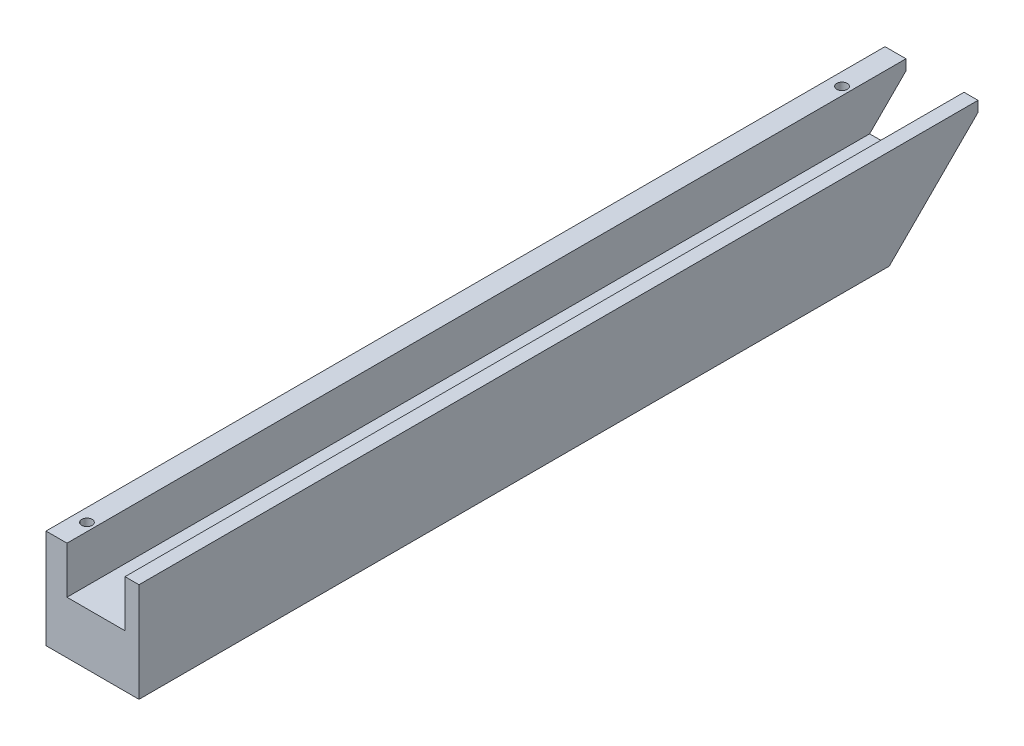
ISO-10303-21;
HEADER;
FILE_DESCRIPTION(('STEP AP214'),'2;1');
FILE_NAME('part.step','',(''),(''),'','','');
FILE_SCHEMA(('AUTOMOTIVE_DESIGN { 1 0 10303 214 1 1 1 1 }'));
ENDSEC;
DATA;
#1=APPLICATION_CONTEXT('core data for automotive mechanical design processes');
#2=APPLICATION_PROTOCOL_DEFINITION('international standard','automotive_design',2000,#1);
#3=PRODUCT_CONTEXT('',#1,'mechanical');
#4=PRODUCT('Part','Part','',(#3));
#5=PRODUCT_RELATED_PRODUCT_CATEGORY('part','',(#4));
#6=PRODUCT_DEFINITION_FORMATION('','',#4);
#7=PRODUCT_DEFINITION_CONTEXT('part definition',#1,'design');
#8=PRODUCT_DEFINITION('design','',#6,#7);
#9=PRODUCT_DEFINITION_SHAPE('','',#8);
#10=(LENGTH_UNIT() NAMED_UNIT(*) SI_UNIT(.MILLI.,.METRE.));
#11=(NAMED_UNIT(*) PLANE_ANGLE_UNIT() SI_UNIT($,.RADIAN.));
#12=(NAMED_UNIT(*) SI_UNIT($,.STERADIAN.) SOLID_ANGLE_UNIT());
#13=UNCERTAINTY_MEASURE_WITH_UNIT(LENGTH_MEASURE(1.E-05),#10,'distance_accuracy_value','');
#14=(GEOMETRIC_REPRESENTATION_CONTEXT(3) GLOBAL_UNCERTAINTY_ASSIGNED_CONTEXT((#13)) GLOBAL_UNIT_ASSIGNED_CONTEXT((#10,
#11,#12)) REPRESENTATION_CONTEXT('',''));
#15=CARTESIAN_POINT('',(0.,0.,0.));
#16=DIRECTION('',(0.,0.,1.));
#17=DIRECTION('',(1.,0.,0.));
#18=AXIS2_PLACEMENT_3D('',#15,#16,#17);
#19=CARTESIAN_POINT('',(0.,0.,0.));
#20=DIRECTION('',(0.,0.,-1.));
#21=DIRECTION('',(-1.,0.,0.));
#22=AXIS2_PLACEMENT_3D('',#19,#20,#21);
#23=PLANE('',#22);
#24=DIRECTION('',(-1.,0.,0.));
#25=VECTOR('',#24,1.);
#26=CARTESIAN_POINT('',(17.2910714285715,5.27857142857141,0.));
#27=LINE('',#26,#25);
#28=CARTESIAN_POINT('',(6.99107142857146,5.27857142857141,0.));
#29=VERTEX_POINT('',#28);
#30=CARTESIAN_POINT('',(3.99107142857146,5.27857142857141,0.));
#31=VERTEX_POINT('',#30);
#32=EDGE_CURVE('E183',#29,#31,#27,.T.);
#33=ORIENTED_EDGE('',*,*,#32,.T.);
#34=DIRECTION('',(0.,-1.,0.));
#35=VECTOR('',#34,1.);
#36=CARTESIAN_POINT('',(3.99107142857146,-7.42142857142859,0.));
#37=LINE('',#36,#35);
#38=CARTESIAN_POINT('',(3.99107142857146,6.77857142857141,0.));
#39=VERTEX_POINT('',#38);
#40=EDGE_CURVE('E137',#39,#31,#37,.T.);
#41=ORIENTED_EDGE('',*,*,#40,.F.);
#42=DIRECTION('',(-1.,0.,0.));
#43=VECTOR('',#42,1.);
#44=CARTESIAN_POINT('',(3.99107142857146,6.77857142857141,0.));
#45=LINE('',#44,#43);
#46=CARTESIAN_POINT('',(6.99107142857146,6.7785714285714,0.));
#47=VERTEX_POINT('',#46);
#48=EDGE_CURVE('E85',#47,#39,#45,.T.);
#49=ORIENTED_EDGE('',*,*,#48,.F.);
#50=DIRECTION('',(0.,1.,0.));
#51=VECTOR('',#50,1.);
#52=CARTESIAN_POINT('',(6.99107142857146,6.7785714285714,0.));
#53=LINE('',#52,#51);
#54=EDGE_CURVE('E148',#29,#47,#53,.T.);
#55=ORIENTED_EDGE('',*,*,#54,.F.);
#56=EDGE_LOOP('',(#33,#41,#49,#55));
#57=FACE_BOUND('',#56,.T.);
#58=ADVANCED_FACE('F39',(#57),#23,.T.);
#59=CARTESIAN_POINT('',(3.99107142857146,-7.42142857142859,120.));
#60=DIRECTION('',(1.,0.,0.));
#61=DIRECTION('',(0.,1.,0.));
#62=AXIS2_PLACEMENT_3D('',#59,#60,#61);
#63=PLANE('',#62);
#64=ORIENTED_EDGE('',*,*,#40,.T.);
#65=DIRECTION('',(0.,0.707106781186549,-0.707106781186546));
#66=VECTOR('',#65,1.);
#67=CARTESIAN_POINT('',(3.99107142857146,-7.42142857142859,12.7));
#68=LINE('',#67,#66);
#69=CARTESIAN_POINT('',(3.99107142857146,-7.42142857142859,12.7));
#70=VERTEX_POINT('',#69);
#71=EDGE_CURVE('E188',#70,#31,#68,.T.);
#72=ORIENTED_EDGE('',*,*,#71,.F.);
#73=DIRECTION('',(0.,0.,-1.));
#74=VECTOR('',#73,1.);
#75=CARTESIAN_POINT('',(3.99107142857146,-7.42142857142859,120.));
#76=LINE('',#75,#74);
#77=CARTESIAN_POINT('',(3.99107142857146,-7.42142857142859,120.));
#78=VERTEX_POINT('',#77);
#79=EDGE_CURVE('E11',#78,#70,#76,.T.);
#80=ORIENTED_EDGE('',*,*,#79,.F.);
#81=DIRECTION('',(0.,-1.,0.));
#82=VECTOR('',#81,1.);
#83=CARTESIAN_POINT('',(3.99107142857146,-7.42142857142859,120.));
#84=LINE('',#83,#82);
#85=CARTESIAN_POINT('',(3.99107142857146,6.77857142857141,120.));
#86=VERTEX_POINT('',#85);
#87=EDGE_CURVE('E151',#86,#78,#84,.T.);
#88=ORIENTED_EDGE('',*,*,#87,.F.);
#89=DIRECTION('',(0.,0.,-1.));
#90=VECTOR('',#89,1.);
#91=CARTESIAN_POINT('',(3.99107142857146,6.77857142857141,120.));
#92=LINE('',#91,#90);
#93=EDGE_CURVE('E133',#86,#39,#92,.T.);
#94=ORIENTED_EDGE('',*,*,#93,.T.);
#95=EDGE_LOOP('',(#64,#72,#80,#88,#94));
#96=FACE_BOUND('',#95,.T.);
#97=ADVANCED_FACE('F41',(#96),#63,.F.);
#98=CARTESIAN_POINT('',(17.2910714285715,-7.42142857142859,120.));
#99=DIRECTION('',(0.,1.,0.));
#100=DIRECTION('',(-1.,0.,0.));
#101=AXIS2_PLACEMENT_3D('',#98,#99,#100);
#102=PLANE('',#101);
#103=CARTESIAN_POINT('',(5.84107142857147,-7.42142857142859,116.));
#104=DIRECTION('',(0.,1.,0.));
#105=DIRECTION('',(0.,0.,1.));
#106=AXIS2_PLACEMENT_3D('',#103,#104,#105);
#107=CIRCLE('',#106,0.750000000000001);
#108=CARTESIAN_POINT('',(5.84107142857147,-7.42142857142859,116.75));
#109=VERTEX_POINT('',#108);
#110=EDGE_CURVE('E197',#109,#109,#107,.T.);
#111=ORIENTED_EDGE('',*,*,#110,.T.);
#112=EDGE_LOOP('',(#111));
#113=FACE_BOUND('',#112,.T.);
#114=ORIENTED_EDGE('',*,*,#79,.T.);
#115=DIRECTION('',(-1.,0.,0.));
#116=VECTOR('',#115,1.);
#117=CARTESIAN_POINT('',(17.2910714285715,-7.42142857142859,12.7));
#118=LINE('',#117,#116);
#119=CARTESIAN_POINT('',(17.2910714285715,-7.42142857142859,12.7));
#120=VERTEX_POINT('',#119);
#121=EDGE_CURVE('E178',#120,#70,#118,.T.);
#122=ORIENTED_EDGE('',*,*,#121,.F.);
#123=DIRECTION('',(0.,0.,-1.));
#124=VECTOR('',#123,1.);
#125=CARTESIAN_POINT('',(17.2910714285715,-7.42142857142859,120.));
#126=LINE('',#125,#124);
#127=CARTESIAN_POINT('',(17.2910714285715,-7.42142857142859,120.));
#128=VERTEX_POINT('',#127);
#129=EDGE_CURVE('E48',#128,#120,#126,.T.);
#130=ORIENTED_EDGE('',*,*,#129,.F.);
#131=DIRECTION('',(1.,0.,0.));
#132=VECTOR('',#131,1.);
#133=CARTESIAN_POINT('',(17.2910714285715,-7.42142857142859,120.));
#134=LINE('',#133,#132);
#135=EDGE_CURVE('E93',#78,#128,#134,.T.);
#136=ORIENTED_EDGE('',*,*,#135,.F.);
#137=EDGE_LOOP('',(#114,#122,#130,#136));
#138=FACE_BOUND('',#137,.T.);
#139=ADVANCED_FACE('F176',(#113,#138),#102,.F.);
#140=CARTESIAN_POINT('',(17.2910714285715,6.77857142857141,120.));
#141=DIRECTION('',(-1.,0.,0.));
#142=DIRECTION('',(0.,0.,1.));
#143=AXIS2_PLACEMENT_3D('',#140,#141,#142);
#144=PLANE('',#143);
#145=ORIENTED_EDGE('',*,*,#129,.T.);
#146=DIRECTION('',(0.,0.707106781186549,-0.707106781186546));
#147=VECTOR('',#146,1.);
#148=CARTESIAN_POINT('',(17.2910714285715,-7.42142857142859,12.7));
#149=LINE('',#148,#147);
#150=CARTESIAN_POINT('',(17.2910714285715,5.27857142857141,0.));
#151=VERTEX_POINT('',#150);
#152=EDGE_CURVE('E169',#120,#151,#149,.T.);
#153=ORIENTED_EDGE('',*,*,#152,.T.);
#154=DIRECTION('',(0.,1.,0.));
#155=VECTOR('',#154,1.);
#156=CARTESIAN_POINT('',(17.2910714285715,6.77857142857141,0.));
#157=LINE('',#156,#155);
#158=CARTESIAN_POINT('',(17.2910714285715,6.77857142857141,0.));
#159=VERTEX_POINT('',#158);
#160=EDGE_CURVE('E140',#151,#159,#157,.T.);
#161=ORIENTED_EDGE('',*,*,#160,.T.);
#162=DIRECTION('',(0.,0.,-1.));
#163=VECTOR('',#162,1.);
#164=CARTESIAN_POINT('',(17.2910714285715,6.77857142857141,120.));
#165=LINE('',#164,#163);
#166=CARTESIAN_POINT('',(17.2910714285715,6.77857142857141,120.));
#167=VERTEX_POINT('',#166);
#168=EDGE_CURVE('E158',#167,#159,#165,.T.);
#169=ORIENTED_EDGE('',*,*,#168,.F.);
#170=DIRECTION('',(0.,1.,0.));
#171=VECTOR('',#170,1.);
#172=CARTESIAN_POINT('',(17.2910714285715,6.77857142857141,120.));
#173=LINE('',#172,#171);
#174=EDGE_CURVE('E172',#128,#167,#173,.T.);
#175=ORIENTED_EDGE('',*,*,#174,.F.);
#176=EDGE_LOOP('',(#145,#153,#161,#169,#175));
#177=FACE_BOUND('',#176,.T.);
#178=ADVANCED_FACE('F166',(#177),#144,.F.);
#179=CARTESIAN_POINT('',(15.2910714285714,6.77857142857141,120.));
#180=DIRECTION('',(0.,-1.,0.));
#181=DIRECTION('',(0.,0.,-1.));
#182=AXIS2_PLACEMENT_3D('',#179,#180,#181);
#183=PLANE('',#182);
#184=DIRECTION('',(-1.,0.,0.));
#185=VECTOR('',#184,1.);
#186=CARTESIAN_POINT('',(15.2910714285714,6.77857142857141,0.));
#187=LINE('',#186,#185);
#188=CARTESIAN_POINT('',(15.2910714285714,6.77857142857141,0.));
#189=VERTEX_POINT('',#188);
#190=EDGE_CURVE('E143',#159,#189,#187,.T.);
#191=ORIENTED_EDGE('',*,*,#190,.T.);
#192=DIRECTION('',(0.,0.,-1.));
#193=VECTOR('',#192,1.);
#194=CARTESIAN_POINT('',(15.2910714285714,6.77857142857141,120.));
#195=LINE('',#194,#193);
#196=CARTESIAN_POINT('',(15.2910714285714,6.77857142857141,120.));
#197=VERTEX_POINT('',#196);
#198=EDGE_CURVE('E155',#197,#189,#195,.T.);
#199=ORIENTED_EDGE('',*,*,#198,.F.);
#200=DIRECTION('',(-1.,0.,0.));
#201=VECTOR('',#200,1.);
#202=CARTESIAN_POINT('',(15.2910714285714,6.77857142857141,120.));
#203=LINE('',#202,#201);
#204=EDGE_CURVE('E207',#167,#197,#203,.T.);
#205=ORIENTED_EDGE('',*,*,#204,.F.);
#206=ORIENTED_EDGE('',*,*,#168,.T.);
#207=EDGE_LOOP('',(#191,#199,#205,#206));
#208=FACE_BOUND('',#207,.T.);
#209=ADVANCED_FACE('F211',(#208),#183,.F.);
#210=CARTESIAN_POINT('',(15.2910714285714,0.0785714285714044,120.));
#211=DIRECTION('',(1.,0.,0.));
#212=DIRECTION('',(0.,0.,-1.));
#213=AXIS2_PLACEMENT_3D('',#210,#211,#212);
#214=PLANE('',#213);
#215=DIRECTION('',(0.,-1.,0.));
#216=VECTOR('',#215,1.);
#217=CARTESIAN_POINT('',(15.2910714285714,0.0785714285714044,0.));
#218=LINE('',#217,#216);
#219=CARTESIAN_POINT('',(15.2910714285714,5.27857142857141,0.));
#220=VERTEX_POINT('',#219);
#221=EDGE_CURVE('E145',#189,#220,#218,.T.);
#222=ORIENTED_EDGE('',*,*,#221,.T.);
#223=DIRECTION('',(0.,-0.707106781186549,0.707106781186546));
#224=VECTOR('',#223,1.);
#225=CARTESIAN_POINT('',(15.2910714285714,-57.3214285714286,62.5999999999998));
#226=LINE('',#225,#224);
#227=CARTESIAN_POINT('',(15.2910714285714,0.0785714285714044,5.19999999999998));
#228=VERTEX_POINT('',#227);
#229=EDGE_CURVE('E55',#220,#228,#226,.T.);
#230=ORIENTED_EDGE('',*,*,#229,.T.);
#231=DIRECTION('',(0.,0.,-1.));
#232=VECTOR('',#231,1.);
#233=CARTESIAN_POINT('',(15.2910714285714,0.0785714285714044,120.));
#234=LINE('',#233,#232);
#235=CARTESIAN_POINT('',(15.2910714285714,0.0785714285714044,120.));
#236=VERTEX_POINT('',#235);
#237=EDGE_CURVE('E128',#236,#228,#234,.T.);
#238=ORIENTED_EDGE('',*,*,#237,.F.);
#239=DIRECTION('',(0.,-1.,0.));
#240=VECTOR('',#239,1.);
#241=CARTESIAN_POINT('',(15.2910714285714,0.0785714285714044,120.));
#242=LINE('',#241,#240);
#243=EDGE_CURVE('E115',#197,#236,#242,.T.);
#244=ORIENTED_EDGE('',*,*,#243,.F.);
#245=ORIENTED_EDGE('',*,*,#198,.T.);
#246=EDGE_LOOP('',(#222,#230,#238,#244,#245));
#247=FACE_BOUND('',#246,.T.);
#248=ADVANCED_FACE('F215',(#247),#214,.F.);
#249=CARTESIAN_POINT('',(6.99107142857146,0.0785714285714044,120.));
#250=DIRECTION('',(0.,-1.,0.));
#251=DIRECTION('',(0.,0.,-1.));
#252=AXIS2_PLACEMENT_3D('',#249,#250,#251);
#253=PLANE('',#252);
#254=ORIENTED_EDGE('',*,*,#237,.T.);
#255=DIRECTION('',(-1.,0.,0.));
#256=VECTOR('',#255,1.);
#257=CARTESIAN_POINT('',(6.99107142857149,0.0785714285714044,5.19999999999998));
#258=LINE('',#257,#256);
#259=CARTESIAN_POINT('',(6.99107142857146,0.078571428571407,5.19999999999998));
#260=VERTEX_POINT('',#259);
#261=EDGE_CURVE('E125',#228,#260,#258,.T.);
#262=ORIENTED_EDGE('',*,*,#261,.T.);
#263=DIRECTION('',(0.,0.,-1.));
#264=VECTOR('',#263,1.);
#265=CARTESIAN_POINT('',(6.99107142857146,0.0785714285714044,120.));
#266=LINE('',#265,#264);
#267=CARTESIAN_POINT('',(6.99107142857146,0.0785714285714044,120.));
#268=VERTEX_POINT('',#267);
#269=EDGE_CURVE('E122',#268,#260,#266,.T.);
#270=ORIENTED_EDGE('',*,*,#269,.F.);
#271=DIRECTION('',(-1.,0.,0.));
#272=VECTOR('',#271,1.);
#273=CARTESIAN_POINT('',(6.99107142857146,0.0785714285714044,120.));
#274=LINE('',#273,#272);
#275=EDGE_CURVE('E108',#236,#268,#274,.T.);
#276=ORIENTED_EDGE('',*,*,#275,.F.);
#277=EDGE_LOOP('',(#254,#262,#270,#276));
#278=FACE_BOUND('',#277,.T.);
#279=ADVANCED_FACE('F123',(#278),#253,.F.);
#280=CARTESIAN_POINT('',(6.99107142857146,6.7785714285714,120.));
#281=DIRECTION('',(-1.,0.,0.));
#282=DIRECTION('',(0.,-1.,0.));
#283=AXIS2_PLACEMENT_3D('',#280,#281,#282);
#284=PLANE('',#283);
#285=ORIENTED_EDGE('',*,*,#269,.T.);
#286=DIRECTION('',(0.,0.707106781186549,-0.707106781186546));
#287=VECTOR('',#286,1.);
#288=CARTESIAN_POINT('',(6.99107142857147,-53.9714285714286,59.2499999999998));
#289=LINE('',#288,#287);
#290=EDGE_CURVE('E192',#260,#29,#289,.T.);
#291=ORIENTED_EDGE('',*,*,#290,.T.);
#292=ORIENTED_EDGE('',*,*,#54,.T.);
#293=DIRECTION('',(0.,0.,-1.));
#294=VECTOR('',#293,1.);
#295=CARTESIAN_POINT('',(6.99107142857146,6.7785714285714,120.));
#296=LINE('',#295,#294);
#297=CARTESIAN_POINT('',(6.99107142857146,6.7785714285714,120.));
#298=VERTEX_POINT('',#297);
#299=EDGE_CURVE('E129',#298,#47,#296,.T.);
#300=ORIENTED_EDGE('',*,*,#299,.F.);
#301=DIRECTION('',(0.,1.,0.));
#302=VECTOR('',#301,1.);
#303=CARTESIAN_POINT('',(6.99107142857146,6.7785714285714,120.));
#304=LINE('',#303,#302);
#305=EDGE_CURVE('E112',#268,#298,#304,.T.);
#306=ORIENTED_EDGE('',*,*,#305,.F.);
#307=EDGE_LOOP('',(#285,#291,#292,#300,#306));
#308=FACE_BOUND('',#307,.T.);
#309=ADVANCED_FACE('F131',(#308),#284,.F.);
#310=CARTESIAN_POINT('',(3.99107142857146,6.77857142857141,120.));
#311=DIRECTION('',(0.,-1.,0.));
#312=DIRECTION('',(1.,0.,0.));
#313=AXIS2_PLACEMENT_3D('',#310,#311,#312);
#314=PLANE('',#313);
#315=CARTESIAN_POINT('',(5.84107142857147,6.77857142857141,116.));
#316=DIRECTION('',(0.,1.,0.));
#317=DIRECTION('',(0.,0.,1.));
#318=AXIS2_PLACEMENT_3D('',#315,#316,#317);
#319=CIRCLE('',#318,0.750000000000001);
#320=CARTESIAN_POINT('',(5.84107142857147,6.77857142857141,116.75));
#321=VERTEX_POINT('',#320);
#322=EDGE_CURVE('E196',#321,#321,#319,.T.);
#323=ORIENTED_EDGE('',*,*,#322,.F.);
#324=EDGE_LOOP('',(#323));
#325=FACE_BOUND('',#324,.T.);
#326=CARTESIAN_POINT('',(5.84107142857146,6.77857142857141,8.));
#327=DIRECTION('',(0.,1.,0.));
#328=DIRECTION('',(0.,0.,1.));
#329=AXIS2_PLACEMENT_3D('',#326,#327,#328);
#330=CIRCLE('',#329,0.75);
#331=CARTESIAN_POINT('',(5.84107142857146,6.77857142857141,8.75));
#332=VERTEX_POINT('',#331);
#333=EDGE_CURVE('E141',#332,#332,#330,.T.);
#334=ORIENTED_EDGE('',*,*,#333,.F.);
#335=EDGE_LOOP('',(#334));
#336=FACE_BOUND('',#335,.T.);
#337=ORIENTED_EDGE('',*,*,#48,.T.);
#338=ORIENTED_EDGE('',*,*,#93,.F.);
#339=DIRECTION('',(-1.,0.,0.));
#340=VECTOR('',#339,1.);
#341=CARTESIAN_POINT('',(3.99107142857146,6.77857142857141,120.));
#342=LINE('',#341,#340);
#343=EDGE_CURVE('E64',#298,#86,#342,.T.);
#344=ORIENTED_EDGE('',*,*,#343,.F.);
#345=ORIENTED_EDGE('',*,*,#299,.T.);
#346=EDGE_LOOP('',(#337,#338,#344,#345));
#347=FACE_BOUND('',#346,.T.);
#348=ADVANCED_FACE('F255',(#325,#336,#347),#314,.F.);
#349=CARTESIAN_POINT('',(0.,0.,120.));
#350=DIRECTION('',(0.,0.,-1.));
#351=DIRECTION('',(-1.,0.,0.));
#352=AXIS2_PLACEMENT_3D('',#349,#350,#351);
#353=PLANE('',#352);
#354=ORIENTED_EDGE('',*,*,#87,.T.);
#355=ORIENTED_EDGE('',*,*,#135,.T.);
#356=ORIENTED_EDGE('',*,*,#174,.T.);
#357=ORIENTED_EDGE('',*,*,#204,.T.);
#358=ORIENTED_EDGE('',*,*,#243,.T.);
#359=ORIENTED_EDGE('',*,*,#275,.T.);
#360=ORIENTED_EDGE('',*,*,#305,.T.);
#361=ORIENTED_EDGE('',*,*,#343,.T.);
#362=EDGE_LOOP('',(#354,#355,#356,#357,#358,#359,#360,#361));
#363=FACE_BOUND('',#362,.T.);
#364=ADVANCED_FACE('F110',(#363),#353,.F.);
#365=EDGE_CURVE('E186',#151,#220,#27,.T.);
#366=ORIENTED_EDGE('',*,*,#365,.T.);
#367=ORIENTED_EDGE('',*,*,#221,.F.);
#368=ORIENTED_EDGE('',*,*,#190,.F.);
#369=ORIENTED_EDGE('',*,*,#160,.F.);
#370=EDGE_LOOP('',(#366,#367,#368,#369));
#371=FACE_BOUND('',#370,.T.);
#372=ADVANCED_FACE('F242',(#371),#23,.T.);
#373=CARTESIAN_POINT('',(5.84107142857146,-7.42142857142859,8.));
#374=DIRECTION('',(0.,1.,0.));
#375=DIRECTION('',(0.,0.,1.));
#376=AXIS2_PLACEMENT_3D('',#373,#374,#375);
#377=CYLINDRICAL_SURFACE('',#376,0.75);
#378=CARTESIAN_POINT('',(5.84107142857146,-2.72142857142862,8.));
#379=DIRECTION('',(0.,0.707106781186546,0.707106781186549));
#380=DIRECTION('',(0.,0.707106781186549,-0.707106781186546));
#381=AXIS2_PLACEMENT_3D('',#378,#379,#380);
#382=ELLIPSE('',#381,1.06066017177982,0.75);
#383=CARTESIAN_POINT('',(5.84107142857146,-1.97142857142861,7.25));
#384=VERTEX_POINT('',#383);
#385=EDGE_CURVE('E43',#384,#384,#382,.F.);
#386=ORIENTED_EDGE('',*,*,#385,.T.);
#387=EDGE_LOOP('',(#386));
#388=FACE_BOUND('',#387,.T.);
#389=ORIENTED_EDGE('',*,*,#333,.T.);
#390=EDGE_LOOP('',(#389));
#391=FACE_BOUND('',#390,.T.);
#392=ADVANCED_FACE('F228',(#388,#391),#377,.F.);
#393=CARTESIAN_POINT('',(5.84107142857147,-7.42142857142859,116.));
#394=DIRECTION('',(0.,1.,0.));
#395=DIRECTION('',(0.,0.,1.));
#396=AXIS2_PLACEMENT_3D('',#393,#394,#395);
#397=CYLINDRICAL_SURFACE('',#396,0.750000000000001);
#398=ORIENTED_EDGE('',*,*,#110,.F.);
#399=EDGE_LOOP('',(#398));
#400=FACE_BOUND('',#399,.T.);
#401=ORIENTED_EDGE('',*,*,#322,.T.);
#402=EDGE_LOOP('',(#401));
#403=FACE_BOUND('',#402,.T.);
#404=ADVANCED_FACE('F232',(#400,#403),#397,.F.);
#405=CARTESIAN_POINT('',(17.2910714285715,-7.42142857142859,12.7));
#406=DIRECTION('',(0.,0.707106781186546,0.707106781186549));
#407=DIRECTION('',(0.,-0.707106781186549,0.707106781186546));
#408=AXIS2_PLACEMENT_3D('',#405,#406,#407);
#409=PLANE('',#408);
#410=ORIENTED_EDGE('',*,*,#385,.F.);
#411=EDGE_LOOP('',(#410));
#412=FACE_BOUND('',#411,.T.);
#413=ORIENTED_EDGE('',*,*,#365,.F.);
#414=ORIENTED_EDGE('',*,*,#152,.F.);
#415=ORIENTED_EDGE('',*,*,#121,.T.);
#416=ORIENTED_EDGE('',*,*,#71,.T.);
#417=ORIENTED_EDGE('',*,*,#32,.F.);
#418=ORIENTED_EDGE('',*,*,#290,.F.);
#419=ORIENTED_EDGE('',*,*,#261,.F.);
#420=ORIENTED_EDGE('',*,*,#229,.F.);
#421=EDGE_LOOP('',(#413,#414,#415,#416,#417,#418,#419,#420));
#422=FACE_BOUND('',#421,.T.);
#423=ADVANCED_FACE('F223',(#412,#422),#409,.F.);
#424=CLOSED_SHELL('',(#58,#97,#139,#178,#209,#248,#279,#309,#348,#364,#372,#392,#404,#423));
#425=MANIFOLD_SOLID_BREP('B2',#424);
#426=ADVANCED_BREP_SHAPE_REPRESENTATION('',(#18,#425),#14);
#427=SHAPE_DEFINITION_REPRESENTATION(#9,#426);
ENDSEC;
END-ISO-10303-21;
